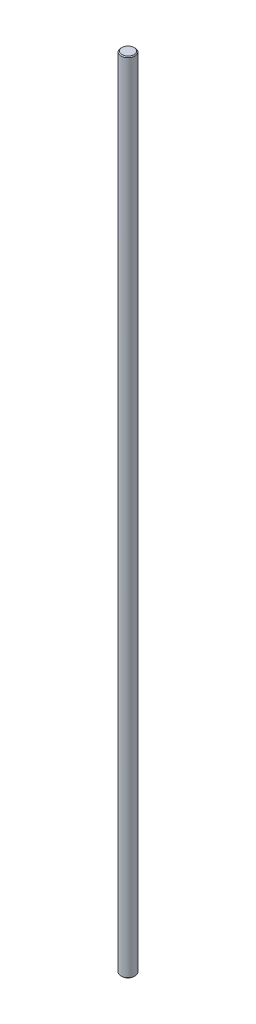
ISO-10303-21;
HEADER;
FILE_DESCRIPTION(('STEP AP214'),'2;1');
FILE_NAME('part.step','',(''),(''),'','','');
FILE_SCHEMA(('AUTOMOTIVE_DESIGN { 1 0 10303 214 1 1 1 1 }'));
ENDSEC;
DATA;
#1=APPLICATION_CONTEXT('core data for automotive mechanical design processes');
#2=APPLICATION_PROTOCOL_DEFINITION('international standard','automotive_design',2000,#1);
#3=PRODUCT_CONTEXT('',#1,'mechanical');
#4=PRODUCT('Part','Part','',(#3));
#5=PRODUCT_RELATED_PRODUCT_CATEGORY('part','',(#4));
#6=PRODUCT_DEFINITION_FORMATION('','',#4);
#7=PRODUCT_DEFINITION_CONTEXT('part definition',#1,'design');
#8=PRODUCT_DEFINITION('design','',#6,#7);
#9=PRODUCT_DEFINITION_SHAPE('','',#8);
#10=(LENGTH_UNIT() NAMED_UNIT(*) SI_UNIT(.MILLI.,.METRE.));
#11=(NAMED_UNIT(*) PLANE_ANGLE_UNIT() SI_UNIT($,.RADIAN.));
#12=(NAMED_UNIT(*) SI_UNIT($,.STERADIAN.) SOLID_ANGLE_UNIT());
#13=UNCERTAINTY_MEASURE_WITH_UNIT(LENGTH_MEASURE(1.E-05),#10,'distance_accuracy_value','');
#14=(GEOMETRIC_REPRESENTATION_CONTEXT(3) GLOBAL_UNCERTAINTY_ASSIGNED_CONTEXT((#13)) GLOBAL_UNIT_ASSIGNED_CONTEXT((#10,
#11,#12)) REPRESENTATION_CONTEXT('',''));
#15=CARTESIAN_POINT('',(0.,0.,0.));
#16=DIRECTION('',(0.,0.,1.));
#17=DIRECTION('',(1.,0.,0.));
#18=AXIS2_PLACEMENT_3D('',#15,#16,#17);
#19=CARTESIAN_POINT('',(0.,455.,0.));
#20=DIRECTION('',(0.,-1.,0.));
#21=DIRECTION('',(0.,0.,-1.));
#22=AXIS2_PLACEMENT_3D('',#19,#20,#21);
#23=CYLINDRICAL_SURFACE('',#22,4.);
#24=CARTESIAN_POINT('',(0.,0.5000000000005,0.));
#25=DIRECTION('',(0.,1.,0.));
#26=DIRECTION('',(0.,0.,1.));
#27=AXIS2_PLACEMENT_3D('',#24,#25,#26);
#28=CIRCLE('',#27,4.);
#29=CARTESIAN_POINT('',(0.,0.5000000000005,-4.));
#30=VERTEX_POINT('',#29);
#31=EDGE_CURVE('E58',#30,#30,#28,.T.);
#32=CARTESIAN_POINT('',(0.,454.5,0.));
#33=DIRECTION('',(0.,1.,0.));
#34=DIRECTION('',(0.,0.,1.));
#35=AXIS2_PLACEMENT_3D('',#32,#33,#34);
#36=CIRCLE('',#35,4.);
#37=CARTESIAN_POINT('',(0.,454.5,-4.));
#38=VERTEX_POINT('',#37);
#39=EDGE_CURVE('E62',#38,#38,#36,.F.);
#40=CARTESIAN_POINT('',(0.,0.5000000000005,-4.));
#41=CARTESIAN_POINT('',(0.,5.22916666666718,-4.));
#42=CARTESIAN_POINT('',(0.,9.95833333333385,-4.));
#43=CARTESIAN_POINT('',(0.,19.4166666666672,-4.));
#44=CARTESIAN_POINT('',(0.,24.1458333333338,-4.));
#45=CARTESIAN_POINT('',(0.,33.6041666666671,-4.));
#46=CARTESIAN_POINT('',(0.,38.3333333333338,-4.));
#47=CARTESIAN_POINT('',(0.,47.7916666666671,-4.));
#48=CARTESIAN_POINT('',(0.,52.5208333333338,-4.));
#49=CARTESIAN_POINT('',(0.,61.9791666666671,-4.));
#50=CARTESIAN_POINT('',(0.,66.7083333333338,-4.));
#51=CARTESIAN_POINT('',(0.,76.1666666666671,-4.));
#52=CARTESIAN_POINT('',(0.,80.8958333333338,-4.));
#53=CARTESIAN_POINT('',(0.,90.3541666666671,-4.));
#54=CARTESIAN_POINT('',(0.,95.0833333333338,-4.));
#55=CARTESIAN_POINT('',(0.,104.541666666667,-4.));
#56=CARTESIAN_POINT('',(0.,109.270833333334,-4.));
#57=CARTESIAN_POINT('',(0.,118.729166666667,-4.));
#58=CARTESIAN_POINT('',(0.,123.458333333334,-4.));
#59=CARTESIAN_POINT('',(0.,132.916666666667,-4.));
#60=CARTESIAN_POINT('',(0.,137.645833333334,-4.));
#61=CARTESIAN_POINT('',(0.,147.104166666667,-4.));
#62=CARTESIAN_POINT('',(0.,151.833333333334,-4.));
#63=CARTESIAN_POINT('',(0.,161.291666666667,-4.));
#64=CARTESIAN_POINT('',(0.,166.020833333334,-4.));
#65=CARTESIAN_POINT('',(0.,175.479166666667,-4.));
#66=CARTESIAN_POINT('',(0.,180.208333333334,-4.));
#67=CARTESIAN_POINT('',(0.,189.666666666667,-4.));
#68=CARTESIAN_POINT('',(0.,194.395833333334,-4.));
#69=CARTESIAN_POINT('',(0.,203.854166666667,-4.));
#70=CARTESIAN_POINT('',(0.,208.583333333334,-4.));
#71=CARTESIAN_POINT('',(0.,218.041666666667,-4.));
#72=CARTESIAN_POINT('',(0.,222.770833333334,-4.));
#73=CARTESIAN_POINT('',(0.,232.229166666667,-4.));
#74=CARTESIAN_POINT('',(0.,236.958333333334,-4.));
#75=CARTESIAN_POINT('',(0.,246.416666666667,-4.));
#76=CARTESIAN_POINT('',(0.,251.145833333334,-4.));
#77=CARTESIAN_POINT('',(0.,260.604166666667,-4.));
#78=CARTESIAN_POINT('',(0.,265.333333333334,-4.));
#79=CARTESIAN_POINT('',(0.,274.791666666667,-4.));
#80=CARTESIAN_POINT('',(0.,279.520833333334,-4.));
#81=CARTESIAN_POINT('',(0.,288.979166666667,-4.));
#82=CARTESIAN_POINT('',(0.,293.708333333334,-4.));
#83=CARTESIAN_POINT('',(0.,303.166666666667,-4.));
#84=CARTESIAN_POINT('',(0.,307.895833333334,-4.));
#85=CARTESIAN_POINT('',(0.,317.354166666667,-4.));
#86=CARTESIAN_POINT('',(0.,322.083333333334,-4.));
#87=CARTESIAN_POINT('',(0.,331.541666666667,-4.));
#88=CARTESIAN_POINT('',(0.,336.270833333334,-4.));
#89=CARTESIAN_POINT('',(0.,345.729166666667,-4.));
#90=CARTESIAN_POINT('',(0.,350.458333333334,-4.));
#91=CARTESIAN_POINT('',(0.,359.916666666667,-4.));
#92=CARTESIAN_POINT('',(0.,364.645833333334,-4.));
#93=CARTESIAN_POINT('',(0.,374.104166666667,-4.));
#94=CARTESIAN_POINT('',(0.,378.833333333334,-4.));
#95=CARTESIAN_POINT('',(0.,388.291666666667,-4.));
#96=CARTESIAN_POINT('',(0.,393.020833333334,-4.));
#97=CARTESIAN_POINT('',(0.,402.479166666667,-4.));
#98=CARTESIAN_POINT('',(0.,407.208333333334,-4.));
#99=CARTESIAN_POINT('',(0.,416.666666666667,-4.));
#100=CARTESIAN_POINT('',(0.,421.395833333334,-4.));
#101=CARTESIAN_POINT('',(0.,430.854166666667,-4.));
#102=CARTESIAN_POINT('',(0.,435.583333333333,-4.));
#103=CARTESIAN_POINT('',(0.,445.041666666667,-4.));
#104=CARTESIAN_POINT('',(0.,449.770833333333,-4.));
#105=CARTESIAN_POINT('',(0.,454.5,-4.));
#106=B_SPLINE_CURVE_WITH_KNOTS('',3,(#40,#41,#42,#43,#44,#45,#46,#47,#48,#49,#50,#51,#52,#53,
#54,#55,#56,#57,#58,#59,#60,#61,#62,#63,#64,#65,#66,#67,#68,#69,#70,#71,#72,#73,#74,#75,#76,#77,
#78,#79,#80,#81,#82,#83,#84,#85,#86,#87,#88,#89,#90,#91,#92,#93,#94,#95,#96,#97,#98,#99,#100,
#101,#102,#103,#104,#105),.UNSPECIFIED.,.F.,.F.,(4,2,2,2,2,2,2,2,2,2,2,2,2,2,2,2,2,2,2,2,2,2,2,
2,2,2,2,2,2,2,2,2,4),(0.,14.1875,28.375,42.5625,56.75,70.9375,85.125,99.3124999999999,113.5,
127.6875,141.875,156.0625,170.25,184.4375,198.625,212.8125,227.,241.1875,255.375,269.5625,
283.75,297.9375,312.125,326.3125,340.5,354.6875,368.875,383.0625,397.25,411.4375,425.625,
439.8125,454.),.UNSPECIFIED.);
#107=EDGE_CURVE('BSEAM47',#30,#38,#106,.T.);
#108=ORIENTED_EDGE('',*,*,#31,.T.);
#109=ORIENTED_EDGE('',*,*,#39,.T.);
#110=ORIENTED_EDGE('',*,*,#107,.T.);
#111=ORIENTED_EDGE('',*,*,#107,.F.);
#112=EDGE_LOOP('',(#108,#110,#109,#111));
#113=FACE_BOUND('',#112,.T.);
#114=ADVANCED_FACE('F47',(#113),#23,.T.);
#115=CARTESIAN_POINT('',(0.,455.,0.));
#116=DIRECTION('',(0.,1.,0.));
#117=DIRECTION('',(0.,0.,1.));
#118=AXIS2_PLACEMENT_3D('',#115,#116,#117);
#119=PLANE('',#118);
#120=CARTESIAN_POINT('',(0.,455.,0.));
#121=DIRECTION('',(0.,1.,0.));
#122=DIRECTION('',(0.,0.,1.));
#123=AXIS2_PLACEMENT_3D('',#120,#121,#122);
#124=CIRCLE('',#123,3.50000000000022);
#125=CARTESIAN_POINT('',(0.,455.,3.50000000000022));
#126=VERTEX_POINT('',#125);
#127=EDGE_CURVE('E12',#126,#126,#124,.T.);
#128=ORIENTED_EDGE('',*,*,#127,.T.);
#129=EDGE_LOOP('',(#128));
#130=FACE_BOUND('',#129,.T.);
#131=ADVANCED_FACE('F78',(#130),#119,.T.);
#132=CARTESIAN_POINT('',(0.,0.,0.));
#133=DIRECTION('',(0.,1.,0.));
#134=DIRECTION('',(0.,0.,1.));
#135=AXIS2_PLACEMENT_3D('',#132,#133,#134);
#136=PLANE('',#135);
#137=CARTESIAN_POINT('',(0.,0.,0.));
#138=DIRECTION('',(0.,1.,0.));
#139=DIRECTION('',(0.,0.,1.));
#140=AXIS2_PLACEMENT_3D('',#137,#138,#139);
#141=CIRCLE('',#140,3.49999999999956);
#142=CARTESIAN_POINT('',(0.,0.,3.49999999999956));
#143=VERTEX_POINT('',#142);
#144=EDGE_CURVE('E54',#143,#143,#141,.F.);
#145=ORIENTED_EDGE('',*,*,#144,.T.);
#146=EDGE_LOOP('',(#145));
#147=FACE_BOUND('',#146,.T.);
#148=ADVANCED_FACE('F75',(#147),#136,.F.);
#149=CARTESIAN_POINT('',(0.,0.5000000000005,0.));
#150=DIRECTION('',(0.,1.,0.));
#151=DIRECTION('',(0.,0.,1.));
#152=AXIS2_PLACEMENT_3D('',#149,#150,#151);
#153=CONICAL_SURFACE('',#152,4.,0.78539816339739);
#154=ORIENTED_EDGE('',*,*,#144,.F.);
#155=EDGE_LOOP('',(#154));
#156=FACE_BOUND('',#155,.T.);
#157=ORIENTED_EDGE('',*,*,#31,.F.);
#158=EDGE_LOOP('',(#157));
#159=FACE_BOUND('',#158,.T.);
#160=ADVANCED_FACE('F71',(#156,#159),#153,.T.);
#161=CARTESIAN_POINT('',(0.,455.,0.));
#162=DIRECTION('',(0.,-1.,0.));
#163=DIRECTION('',(0.,0.,-1.));
#164=AXIS2_PLACEMENT_3D('',#161,#162,#163);
#165=CONICAL_SURFACE('',#164,3.50000000000022,0.785398163397446);
#166=ORIENTED_EDGE('',*,*,#39,.F.);
#167=EDGE_LOOP('',(#166));
#168=FACE_BOUND('',#167,.T.);
#169=ORIENTED_EDGE('',*,*,#127,.F.);
#170=EDGE_LOOP('',(#169));
#171=FACE_BOUND('',#170,.T.);
#172=ADVANCED_FACE('F49',(#168,#171),#165,.T.);
#173=CLOSED_SHELL('',(#114,#131,#148,#160,#172));
#174=MANIFOLD_SOLID_BREP('B2',#173);
#175=ADVANCED_BREP_SHAPE_REPRESENTATION('',(#18,#174),#14);
#176=SHAPE_DEFINITION_REPRESENTATION(#9,#175);
ENDSEC;
END-ISO-10303-21;
